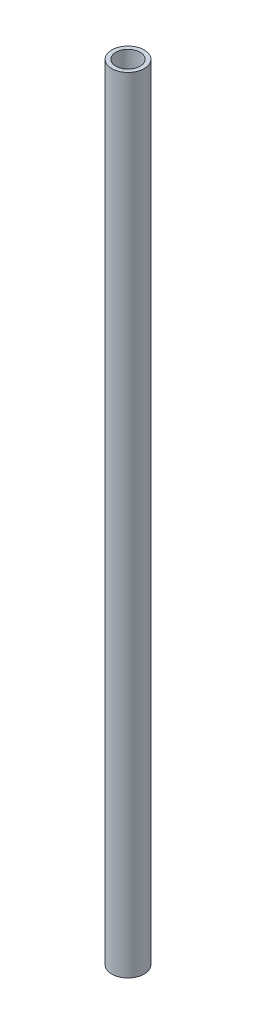
ISO-10303-21;
HEADER;
FILE_DESCRIPTION(('STEP AP214'),'2;1');
FILE_NAME('part.step','',(''),(''),'','','');
FILE_SCHEMA(('AUTOMOTIVE_DESIGN { 1 0 10303 214 1 1 1 1 }'));
ENDSEC;
DATA;
#1=APPLICATION_CONTEXT('core data for automotive mechanical design processes');
#2=APPLICATION_PROTOCOL_DEFINITION('international standard','automotive_design',2000,#1);
#3=PRODUCT_CONTEXT('',#1,'mechanical');
#4=PRODUCT('Part','Part','',(#3));
#5=PRODUCT_RELATED_PRODUCT_CATEGORY('part','',(#4));
#6=PRODUCT_DEFINITION_FORMATION('','',#4);
#7=PRODUCT_DEFINITION_CONTEXT('part definition',#1,'design');
#8=PRODUCT_DEFINITION('design','',#6,#7);
#9=PRODUCT_DEFINITION_SHAPE('','',#8);
#10=(LENGTH_UNIT() NAMED_UNIT(*) SI_UNIT(.MILLI.,.METRE.));
#11=(NAMED_UNIT(*) PLANE_ANGLE_UNIT() SI_UNIT($,.RADIAN.));
#12=(NAMED_UNIT(*) SI_UNIT($,.STERADIAN.) SOLID_ANGLE_UNIT());
#13=UNCERTAINTY_MEASURE_WITH_UNIT(LENGTH_MEASURE(1.E-05),#10,'distance_accuracy_value','');
#14=(GEOMETRIC_REPRESENTATION_CONTEXT(3) GLOBAL_UNCERTAINTY_ASSIGNED_CONTEXT((#13)) GLOBAL_UNIT_ASSIGNED_CONTEXT((#10,
#11,#12)) REPRESENTATION_CONTEXT('',''));
#15=CARTESIAN_POINT('',(0.,0.,0.));
#16=DIRECTION('',(0.,0.,1.));
#17=DIRECTION('',(1.,0.,0.));
#18=AXIS2_PLACEMENT_3D('',#15,#16,#17);
#19=CARTESIAN_POINT('',(0.,122.936,0.));
#20=DIRECTION('',(0.,1.,0.));
#21=DIRECTION('',(0.,0.,1.));
#22=AXIS2_PLACEMENT_3D('',#19,#20,#21);
#23=PLANE('',#22);
#24=CARTESIAN_POINT('',(0.,122.936,0.));
#25=DIRECTION('',(0.,1.,0.));
#26=DIRECTION('',(0.,0.,1.));
#27=AXIS2_PLACEMENT_3D('',#24,#25,#26);
#28=CIRCLE('',#27,2.54);
#29=CARTESIAN_POINT('',(0.,122.936,2.54));
#30=VERTEX_POINT('',#29);
#31=EDGE_CURVE('E10',#30,#30,#28,.T.);
#32=ORIENTED_EDGE('',*,*,#31,.T.);
#33=EDGE_LOOP('',(#32));
#34=FACE_BOUND('',#33,.T.);
#35=CARTESIAN_POINT('',(0.,122.936,0.));
#36=DIRECTION('',(0.,1.,0.));
#37=DIRECTION('',(0.,0.,1.));
#38=AXIS2_PLACEMENT_3D('',#35,#36,#37);
#39=CIRCLE('',#38,1.905);
#40=CARTESIAN_POINT('',(0.,122.936,1.905));
#41=VERTEX_POINT('',#40);
#42=EDGE_CURVE('E50',#41,#41,#39,.T.);
#43=ORIENTED_EDGE('',*,*,#42,.F.);
#44=EDGE_LOOP('',(#43));
#45=FACE_BOUND('',#44,.T.);
#46=ADVANCED_FACE('F37',(#34,#45),#23,.T.);
#47=CARTESIAN_POINT('',(0.,0.,0.));
#48=DIRECTION('',(0.,1.,0.));
#49=DIRECTION('',(0.,0.,1.));
#50=AXIS2_PLACEMENT_3D('',#47,#48,#49);
#51=PLANE('',#50);
#52=CARTESIAN_POINT('',(0.,0.,0.));
#53=DIRECTION('',(0.,1.,0.));
#54=DIRECTION('',(0.,0.,1.));
#55=AXIS2_PLACEMENT_3D('',#52,#53,#54);
#56=CIRCLE('',#55,2.54);
#57=CARTESIAN_POINT('',(0.,0.,2.54));
#58=VERTEX_POINT('',#57);
#59=EDGE_CURVE('E41',#58,#58,#56,.T.);
#60=ORIENTED_EDGE('',*,*,#59,.F.);
#61=EDGE_LOOP('',(#60));
#62=FACE_BOUND('',#61,.T.);
#63=CARTESIAN_POINT('',(0.,0.,0.));
#64=DIRECTION('',(0.,1.,0.));
#65=DIRECTION('',(0.,0.,1.));
#66=AXIS2_PLACEMENT_3D('',#63,#64,#65);
#67=CIRCLE('',#66,1.905);
#68=CARTESIAN_POINT('',(0.,0.,1.905));
#69=VERTEX_POINT('',#68);
#70=EDGE_CURVE('E52',#69,#69,#67,.T.);
#71=ORIENTED_EDGE('',*,*,#70,.T.);
#72=EDGE_LOOP('',(#71));
#73=FACE_BOUND('',#72,.T.);
#74=ADVANCED_FACE('F64',(#62,#73),#51,.F.);
#75=CARTESIAN_POINT('',(0.,122.936,0.));
#76=DIRECTION('',(0.,-1.,0.));
#77=DIRECTION('',(0.,0.,-1.));
#78=AXIS2_PLACEMENT_3D('',#75,#76,#77);
#79=CYLINDRICAL_SURFACE('',#78,2.54);
#80=ORIENTED_EDGE('',*,*,#31,.F.);
#81=EDGE_LOOP('',(#80));
#82=FACE_BOUND('',#81,.T.);
#83=ORIENTED_EDGE('',*,*,#59,.T.);
#84=EDGE_LOOP('',(#83));
#85=FACE_BOUND('',#84,.T.);
#86=ADVANCED_FACE('F39',(#82,#85),#79,.T.);
#87=CARTESIAN_POINT('',(0.,122.936,0.));
#88=DIRECTION('',(0.,-1.,0.));
#89=DIRECTION('',(0.,0.,-1.));
#90=AXIS2_PLACEMENT_3D('',#87,#88,#89);
#91=CYLINDRICAL_SURFACE('',#90,1.905);
#92=ORIENTED_EDGE('',*,*,#42,.T.);
#93=EDGE_LOOP('',(#92));
#94=FACE_BOUND('',#93,.T.);
#95=ORIENTED_EDGE('',*,*,#70,.F.);
#96=EDGE_LOOP('',(#95));
#97=FACE_BOUND('',#96,.T.);
#98=ADVANCED_FACE('F60',(#94,#97),#91,.F.);
#99=CLOSED_SHELL('',(#46,#74,#86,#98));
#100=MANIFOLD_SOLID_BREP('B2',#99);
#101=ADVANCED_BREP_SHAPE_REPRESENTATION('',(#18,#100),#14);
#102=SHAPE_DEFINITION_REPRESENTATION(#9,#101);
ENDSEC;
END-ISO-10303-21;
